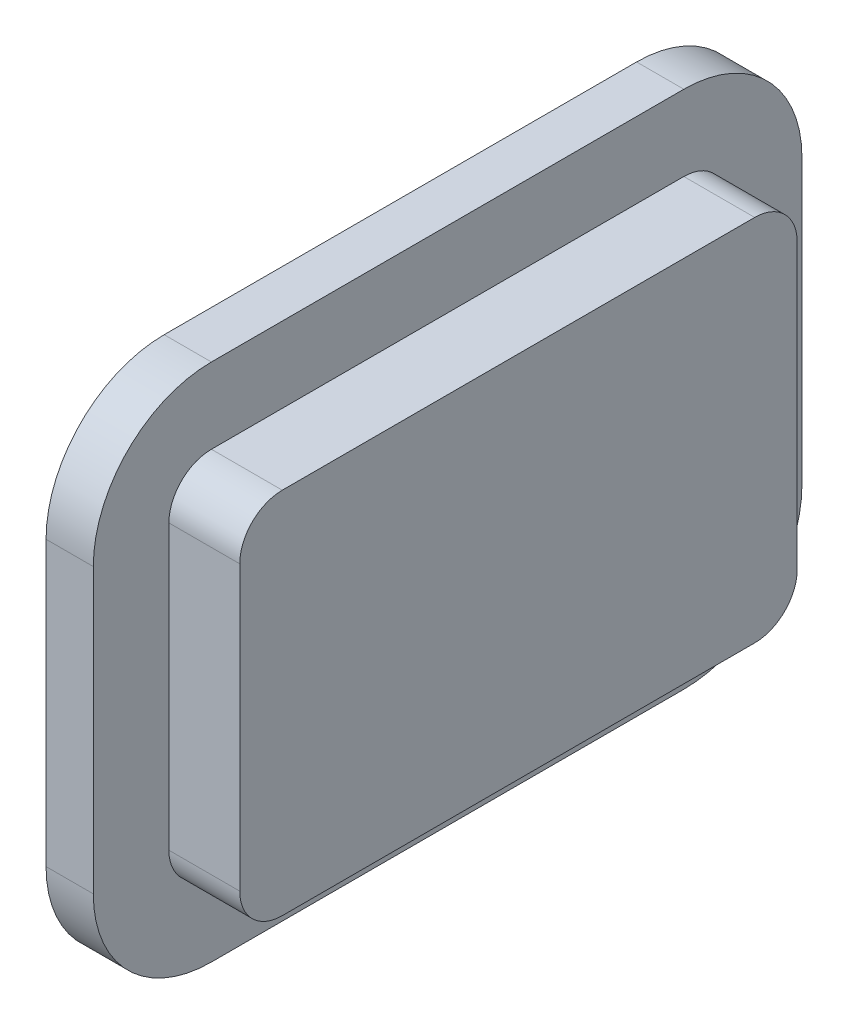
ISO-10303-21;
HEADER;
FILE_DESCRIPTION(('STEP AP214'),'2;1');
FILE_NAME('part.step','',(''),(''),'','','');
FILE_SCHEMA(('AUTOMOTIVE_DESIGN { 1 0 10303 214 1 1 1 1 }'));
ENDSEC;
DATA;
#1=APPLICATION_CONTEXT('core data for automotive mechanical design processes');
#2=APPLICATION_PROTOCOL_DEFINITION('international standard','automotive_design',2000,#1);
#3=PRODUCT_CONTEXT('',#1,'mechanical');
#4=PRODUCT('Part','Part','',(#3));
#5=PRODUCT_RELATED_PRODUCT_CATEGORY('part','',(#4));
#6=PRODUCT_DEFINITION_FORMATION('','',#4);
#7=PRODUCT_DEFINITION_CONTEXT('part definition',#1,'design');
#8=PRODUCT_DEFINITION('design','',#6,#7);
#9=PRODUCT_DEFINITION_SHAPE('','',#8);
#10=(LENGTH_UNIT() NAMED_UNIT(*) SI_UNIT(.MILLI.,.METRE.));
#11=(NAMED_UNIT(*) PLANE_ANGLE_UNIT() SI_UNIT($,.RADIAN.));
#12=(NAMED_UNIT(*) SI_UNIT($,.STERADIAN.) SOLID_ANGLE_UNIT());
#13=UNCERTAINTY_MEASURE_WITH_UNIT(LENGTH_MEASURE(1.E-05),#10,'distance_accuracy_value','');
#14=(GEOMETRIC_REPRESENTATION_CONTEXT(3) GLOBAL_UNCERTAINTY_ASSIGNED_CONTEXT((#13)) GLOBAL_UNIT_ASSIGNED_CONTEXT((#10,
#11,#12)) REPRESENTATION_CONTEXT('',''));
#15=CARTESIAN_POINT('',(0.,0.,0.));
#16=DIRECTION('',(0.,0.,1.));
#17=DIRECTION('',(1.,0.,0.));
#18=AXIS2_PLACEMENT_3D('',#15,#16,#17);
#19=CARTESIAN_POINT('',(-61.,18.8499999999999,-26.3223304703364));
#20=DIRECTION('',(0.,-1.,0.));
#21=DIRECTION('',(0.,0.,-1.));
#22=AXIS2_PLACEMENT_3D('',#19,#20,#21);
#23=PLANE('',#22);
#24=DIRECTION('',(0.,0.,-1.));
#25=VECTOR('',#24,1.);
#26=CARTESIAN_POINT('',(-60.,18.8499999999999,-26.3223304703364));
#27=LINE('',#26,#25);
#28=CARTESIAN_POINT('',(-60.,18.8499999999999,-26.3223304703364));
#29=VERTEX_POINT('',#28);
#30=CARTESIAN_POINT('',(-60.,18.8499999999999,-36.3223304703364));
#31=VERTEX_POINT('',#30);
#32=EDGE_CURVE('E164',#29,#31,#27,.T.);
#33=ORIENTED_EDGE('',*,*,#32,.T.);
#34=DIRECTION('',(1.,0.,0.));
#35=VECTOR('',#34,1.);
#36=CARTESIAN_POINT('',(-61.,18.8499999999999,-36.3223304703364));
#37=LINE('',#36,#35);
#38=CARTESIAN_POINT('',(-61.,18.8499999999999,-36.3223304703364));
#39=VERTEX_POINT('',#38);
#40=EDGE_CURVE('E11',#39,#31,#37,.T.);
#41=ORIENTED_EDGE('',*,*,#40,.F.);
#42=DIRECTION('',(0.,0.,-1.));
#43=VECTOR('',#42,1.);
#44=CARTESIAN_POINT('',(-61.,18.8499999999999,-26.3223304703364));
#45=LINE('',#44,#43);
#46=CARTESIAN_POINT('',(-61.,18.8499999999999,-26.3223304703364));
#47=VERTEX_POINT('',#46);
#48=EDGE_CURVE('E186',#47,#39,#45,.T.);
#49=ORIENTED_EDGE('',*,*,#48,.F.);
#50=DIRECTION('',(1.,0.,0.));
#51=VECTOR('',#50,1.);
#52=CARTESIAN_POINT('',(-61.,18.8499999999999,-26.3223304703364));
#53=LINE('',#52,#51);
#54=EDGE_CURVE('E160',#47,#29,#53,.T.);
#55=ORIENTED_EDGE('',*,*,#54,.T.);
#56=EDGE_LOOP('',(#33,#41,#49,#55));
#57=FACE_BOUND('',#56,.T.);
#58=ADVANCED_FACE('F43',(#57),#23,.F.);
#59=CARTESIAN_POINT('',(-61.,16.3499999999999,-36.3223304703364));
#60=DIRECTION('',(1.,0.,0.));
#61=DIRECTION('',(0.,0.,-1.));
#62=AXIS2_PLACEMENT_3D('',#59,#60,#61);
#63=CYLINDRICAL_SURFACE('',#62,2.5);
#64=CARTESIAN_POINT('',(-60.,16.3499999999999,-36.3223304703364));
#65=DIRECTION('',(-1.,0.,0.));
#66=DIRECTION('',(0.,0.,1.));
#67=AXIS2_PLACEMENT_3D('',#64,#65,#66);
#68=CIRCLE('',#67,2.5);
#69=CARTESIAN_POINT('',(-60.,16.3499999999999,-38.8223304703364));
#70=VERTEX_POINT('',#69);
#71=EDGE_CURVE('E168',#31,#70,#68,.T.);
#72=ORIENTED_EDGE('',*,*,#71,.T.);
#73=DIRECTION('',(1.,0.,0.));
#74=VECTOR('',#73,1.);
#75=CARTESIAN_POINT('',(-61.,16.3499999999999,-38.8223304703364));
#76=LINE('',#75,#74);
#77=CARTESIAN_POINT('',(-61.,16.3499999999999,-38.8223304703364));
#78=VERTEX_POINT('',#77);
#79=EDGE_CURVE('E51',#78,#70,#76,.T.);
#80=ORIENTED_EDGE('',*,*,#79,.F.);
#81=CARTESIAN_POINT('',(-61.,16.3499999999999,-36.3223304703364));
#82=DIRECTION('',(-1.,0.,0.));
#83=DIRECTION('',(0.,0.,1.));
#84=AXIS2_PLACEMENT_3D('',#81,#82,#83);
#85=CIRCLE('',#84,2.5);
#86=EDGE_CURVE('E116',#39,#78,#85,.T.);
#87=ORIENTED_EDGE('',*,*,#86,.F.);
#88=ORIENTED_EDGE('',*,*,#40,.T.);
#89=EDGE_LOOP('',(#72,#80,#87,#88));
#90=FACE_BOUND('',#89,.T.);
#91=ADVANCED_FACE('F403',(#90),#63,.T.);
#92=CARTESIAN_POINT('',(-61.,16.3499999999999,-38.8223304703364));
#93=DIRECTION('',(0.,0.,1.));
#94=DIRECTION('',(1.,0.,0.));
#95=AXIS2_PLACEMENT_3D('',#92,#93,#94);
#96=PLANE('',#95);
#97=DIRECTION('',(0.,-1.,0.));
#98=VECTOR('',#97,1.);
#99=CARTESIAN_POINT('',(-60.,16.3499999999999,-38.8223304703364));
#100=LINE('',#99,#98);
#101=CARTESIAN_POINT('',(-60.,10.3499999999999,-38.8223304703364));
#102=VERTEX_POINT('',#101);
#103=EDGE_CURVE('E172',#70,#102,#100,.T.);
#104=ORIENTED_EDGE('',*,*,#103,.T.);
#105=DIRECTION('',(1.,0.,0.));
#106=VECTOR('',#105,1.);
#107=CARTESIAN_POINT('',(-61.,10.3499999999999,-38.8223304703364));
#108=LINE('',#107,#106);
#109=CARTESIAN_POINT('',(-61.,10.3499999999999,-38.8223304703364));
#110=VERTEX_POINT('',#109);
#111=EDGE_CURVE('E195',#110,#102,#108,.T.);
#112=ORIENTED_EDGE('',*,*,#111,.F.);
#113=DIRECTION('',(0.,-1.,0.));
#114=VECTOR('',#113,1.);
#115=CARTESIAN_POINT('',(-61.,16.3499999999999,-38.8223304703364));
#116=LINE('',#115,#114);
#117=EDGE_CURVE('E206',#78,#110,#116,.T.);
#118=ORIENTED_EDGE('',*,*,#117,.F.);
#119=ORIENTED_EDGE('',*,*,#79,.T.);
#120=EDGE_LOOP('',(#104,#112,#118,#119));
#121=FACE_BOUND('',#120,.T.);
#122=ADVANCED_FACE('F204',(#121),#96,.F.);
#123=CARTESIAN_POINT('',(-61.,10.3499999999999,-36.3223304703364));
#124=DIRECTION('',(1.,0.,0.));
#125=DIRECTION('',(0.,0.,-1.));
#126=AXIS2_PLACEMENT_3D('',#123,#124,#125);
#127=CYLINDRICAL_SURFACE('',#126,2.5);
#128=CARTESIAN_POINT('',(-60.,10.3499999999999,-36.3223304703364));
#129=DIRECTION('',(-1.,0.,0.));
#130=DIRECTION('',(0.,0.,1.));
#131=AXIS2_PLACEMENT_3D('',#128,#129,#130);
#132=CIRCLE('',#131,2.5);
#133=CARTESIAN_POINT('',(-60.,7.84999999999987,-36.3223304703364));
#134=VERTEX_POINT('',#133);
#135=EDGE_CURVE('E175',#102,#134,#132,.T.);
#136=ORIENTED_EDGE('',*,*,#135,.T.);
#137=DIRECTION('',(1.,0.,0.));
#138=VECTOR('',#137,1.);
#139=CARTESIAN_POINT('',(-61.,7.84999999999987,-36.3223304703364));
#140=LINE('',#139,#138);
#141=CARTESIAN_POINT('',(-61.,7.84999999999987,-36.3223304703364));
#142=VERTEX_POINT('',#141);
#143=EDGE_CURVE('E191',#142,#134,#140,.T.);
#144=ORIENTED_EDGE('',*,*,#143,.F.);
#145=CARTESIAN_POINT('',(-61.,10.3499999999999,-36.3223304703364));
#146=DIRECTION('',(-1.,0.,0.));
#147=DIRECTION('',(0.,0.,1.));
#148=AXIS2_PLACEMENT_3D('',#145,#146,#147);
#149=CIRCLE('',#148,2.5);
#150=EDGE_CURVE('E219',#110,#142,#149,.T.);
#151=ORIENTED_EDGE('',*,*,#150,.F.);
#152=ORIENTED_EDGE('',*,*,#111,.T.);
#153=EDGE_LOOP('',(#136,#144,#151,#152));
#154=FACE_BOUND('',#153,.T.);
#155=ADVANCED_FACE('F214',(#154),#127,.T.);
#156=CARTESIAN_POINT('',(-61.,7.84999999999987,-36.3223304703364));
#157=DIRECTION('',(0.,1.,0.));
#158=DIRECTION('',(0.,0.,1.));
#159=AXIS2_PLACEMENT_3D('',#156,#157,#158);
#160=PLANE('',#159);
#161=DIRECTION('',(0.,0.,1.));
#162=VECTOR('',#161,1.);
#163=CARTESIAN_POINT('',(-60.,7.84999999999987,-36.3223304703364));
#164=LINE('',#163,#162);
#165=CARTESIAN_POINT('',(-60.,7.84999999999987,-26.3223304703364));
#166=VERTEX_POINT('',#165);
#167=EDGE_CURVE('E178',#134,#166,#164,.T.);
#168=ORIENTED_EDGE('',*,*,#167,.T.);
#169=DIRECTION('',(1.,0.,0.));
#170=VECTOR('',#169,1.);
#171=CARTESIAN_POINT('',(-61.,7.84999999999987,-26.3223304703364));
#172=LINE('',#171,#170);
#173=CARTESIAN_POINT('',(-61.,7.84999999999987,-26.3223304703364));
#174=VERTEX_POINT('',#173);
#175=EDGE_CURVE('E155',#174,#166,#172,.T.);
#176=ORIENTED_EDGE('',*,*,#175,.F.);
#177=DIRECTION('',(0.,0.,1.));
#178=VECTOR('',#177,1.);
#179=CARTESIAN_POINT('',(-61.,7.84999999999987,-36.3223304703364));
#180=LINE('',#179,#178);
#181=EDGE_CURVE('E142',#142,#174,#180,.T.);
#182=ORIENTED_EDGE('',*,*,#181,.F.);
#183=ORIENTED_EDGE('',*,*,#143,.T.);
#184=EDGE_LOOP('',(#168,#176,#182,#183));
#185=FACE_BOUND('',#184,.T.);
#186=ADVANCED_FACE('F217',(#185),#160,.F.);
#187=CARTESIAN_POINT('',(-61.,10.3499999999999,-26.3223304703364));
#188=DIRECTION('',(1.,0.,0.));
#189=DIRECTION('',(0.,0.,-1.));
#190=AXIS2_PLACEMENT_3D('',#187,#188,#189);
#191=CYLINDRICAL_SURFACE('',#190,2.5);
#192=CARTESIAN_POINT('',(-60.,10.3499999999999,-26.3223304703364));
#193=DIRECTION('',(-1.,0.,0.));
#194=DIRECTION('',(0.,0.,1.));
#195=AXIS2_PLACEMENT_3D('',#192,#193,#194);
#196=CIRCLE('',#195,2.5);
#197=CARTESIAN_POINT('',(-60.,10.3499999999999,-23.8223304703364));
#198=VERTEX_POINT('',#197);
#199=EDGE_CURVE('E152',#166,#198,#196,.T.);
#200=ORIENTED_EDGE('',*,*,#199,.T.);
#201=DIRECTION('',(1.,0.,0.));
#202=VECTOR('',#201,1.);
#203=CARTESIAN_POINT('',(-61.,10.3499999999999,-23.8223304703364));
#204=LINE('',#203,#202);
#205=CARTESIAN_POINT('',(-61.,10.3499999999999,-23.8223304703364));
#206=VERTEX_POINT('',#205);
#207=EDGE_CURVE('E149',#206,#198,#204,.T.);
#208=ORIENTED_EDGE('',*,*,#207,.F.);
#209=CARTESIAN_POINT('',(-61.,10.3499999999999,-26.3223304703364));
#210=DIRECTION('',(-1.,0.,0.));
#211=DIRECTION('',(0.,0.,1.));
#212=AXIS2_PLACEMENT_3D('',#209,#210,#211);
#213=CIRCLE('',#212,2.5);
#214=EDGE_CURVE('E135',#174,#206,#213,.T.);
#215=ORIENTED_EDGE('',*,*,#214,.F.);
#216=ORIENTED_EDGE('',*,*,#175,.T.);
#217=EDGE_LOOP('',(#200,#208,#215,#216));
#218=FACE_BOUND('',#217,.T.);
#219=ADVANCED_FACE('F150',(#218),#191,.T.);
#220=CARTESIAN_POINT('',(-61.,10.3499999999999,-23.8223304703364));
#221=DIRECTION('',(0.,0.,-1.));
#222=DIRECTION('',(-1.,0.,0.));
#223=AXIS2_PLACEMENT_3D('',#220,#221,#222);
#224=PLANE('',#223);
#225=DIRECTION('',(0.,1.,0.));
#226=VECTOR('',#225,1.);
#227=CARTESIAN_POINT('',(-60.,10.3499999999999,-23.8223304703364));
#228=LINE('',#227,#226);
#229=CARTESIAN_POINT('',(-60.,16.3499999999999,-23.8223304703364));
#230=VERTEX_POINT('',#229);
#231=EDGE_CURVE('E183',#198,#230,#228,.T.);
#232=ORIENTED_EDGE('',*,*,#231,.T.);
#233=DIRECTION('',(1.,0.,0.));
#234=VECTOR('',#233,1.);
#235=CARTESIAN_POINT('',(-61.,16.3499999999999,-23.8223304703364));
#236=LINE('',#235,#234);
#237=CARTESIAN_POINT('',(-61.,16.3499999999999,-23.8223304703364));
#238=VERTEX_POINT('',#237);
#239=EDGE_CURVE('E156',#238,#230,#236,.T.);
#240=ORIENTED_EDGE('',*,*,#239,.F.);
#241=DIRECTION('',(0.,1.,0.));
#242=VECTOR('',#241,1.);
#243=CARTESIAN_POINT('',(-61.,10.3499999999999,-23.8223304703364));
#244=LINE('',#243,#242);
#245=EDGE_CURVE('E139',#206,#238,#244,.T.);
#246=ORIENTED_EDGE('',*,*,#245,.F.);
#247=ORIENTED_EDGE('',*,*,#207,.T.);
#248=EDGE_LOOP('',(#232,#240,#246,#247));
#249=FACE_BOUND('',#248,.T.);
#250=ADVANCED_FACE('F158',(#249),#224,.F.);
#251=CARTESIAN_POINT('',(-61.,16.3499999999999,-26.3223304703364));
#252=DIRECTION('',(1.,0.,0.));
#253=DIRECTION('',(0.,0.,-1.));
#254=AXIS2_PLACEMENT_3D('',#251,#252,#253);
#255=CYLINDRICAL_SURFACE('',#254,2.5);
#256=CARTESIAN_POINT('',(-60.,16.3499999999999,-26.3223304703364));
#257=DIRECTION('',(-1.,0.,0.));
#258=DIRECTION('',(0.,0.,1.));
#259=AXIS2_PLACEMENT_3D('',#256,#257,#258);
#260=CIRCLE('',#259,2.5);
#261=EDGE_CURVE('E105',#230,#29,#260,.T.);
#262=ORIENTED_EDGE('',*,*,#261,.T.);
#263=ORIENTED_EDGE('',*,*,#54,.F.);
#264=CARTESIAN_POINT('',(-61.,16.3499999999999,-26.3223304703364));
#265=DIRECTION('',(-1.,0.,0.));
#266=DIRECTION('',(0.,0.,1.));
#267=AXIS2_PLACEMENT_3D('',#264,#265,#266);
#268=CIRCLE('',#267,2.5);
#269=EDGE_CURVE('E67',#238,#47,#268,.T.);
#270=ORIENTED_EDGE('',*,*,#269,.F.);
#271=ORIENTED_EDGE('',*,*,#239,.T.);
#272=EDGE_LOOP('',(#262,#263,#270,#271));
#273=FACE_BOUND('',#272,.T.);
#274=ADVANCED_FACE('F410',(#273),#255,.T.);
#275=CARTESIAN_POINT('',(-61.,16.3499999999999,-36.3223304703364));
#276=DIRECTION('',(-1.,0.,0.));
#277=DIRECTION('',(0.,0.,1.));
#278=AXIS2_PLACEMENT_3D('',#275,#276,#277);
#279=PLANE('',#278);
#280=ORIENTED_EDGE('',*,*,#48,.T.);
#281=ORIENTED_EDGE('',*,*,#86,.T.);
#282=ORIENTED_EDGE('',*,*,#117,.T.);
#283=ORIENTED_EDGE('',*,*,#150,.T.);
#284=ORIENTED_EDGE('',*,*,#181,.T.);
#285=ORIENTED_EDGE('',*,*,#214,.T.);
#286=ORIENTED_EDGE('',*,*,#245,.T.);
#287=ORIENTED_EDGE('',*,*,#269,.T.);
#288=EDGE_LOOP('',(#280,#281,#282,#283,#284,#285,#286,#287));
#289=FACE_BOUND('',#288,.T.);
#290=ADVANCED_FACE('F137',(#289),#279,.T.);
#291=CARTESIAN_POINT('',(-60.,16.3499999999999,-36.3223304703364));
#292=DIRECTION('',(-1.,0.,0.));
#293=DIRECTION('',(0.,0.,1.));
#294=AXIS2_PLACEMENT_3D('',#291,#292,#293);
#295=PLANE('',#294);
#296=DIRECTION('',(0.,1.,0.));
#297=VECTOR('',#296,1.);
#298=CARTESIAN_POINT('',(-60.,10.3499999999999,-25.4223304703364));
#299=LINE('',#298,#297);
#300=CARTESIAN_POINT('',(-60.,10.3499999999999,-25.4223304703364));
#301=VERTEX_POINT('',#300);
#302=CARTESIAN_POINT('',(-60.,16.3499999999999,-25.4223304703364));
#303=VERTEX_POINT('',#302);
#304=EDGE_CURVE('E258',#301,#303,#299,.T.);
#305=ORIENTED_EDGE('',*,*,#304,.T.);
#306=CARTESIAN_POINT('',(-60.,16.3499999999999,-26.3223304703364));
#307=DIRECTION('',(-1.,0.,0.));
#308=DIRECTION('',(0.,0.,1.));
#309=AXIS2_PLACEMENT_3D('',#306,#307,#308);
#310=CIRCLE('',#309,0.9);
#311=CARTESIAN_POINT('',(-60.,17.2499999999999,-26.3223304703364));
#312=VERTEX_POINT('',#311);
#313=EDGE_CURVE('E58',#303,#312,#310,.T.);
#314=ORIENTED_EDGE('',*,*,#313,.T.);
#315=DIRECTION('',(0.,0.,-1.));
#316=VECTOR('',#315,1.);
#317=CARTESIAN_POINT('',(-60.,17.2499999999999,-26.3223304703364));
#318=LINE('',#317,#316);
#319=CARTESIAN_POINT('',(-60.,17.2499999999999,-36.3223304703364));
#320=VERTEX_POINT('',#319);
#321=EDGE_CURVE('E283',#312,#320,#318,.T.);
#322=ORIENTED_EDGE('',*,*,#321,.T.);
#323=CARTESIAN_POINT('',(-60.,16.3499999999999,-36.3223304703364));
#324=DIRECTION('',(-1.,0.,0.));
#325=DIRECTION('',(0.,0.,1.));
#326=AXIS2_PLACEMENT_3D('',#323,#324,#325);
#327=CIRCLE('',#326,0.899999999999998);
#328=CARTESIAN_POINT('',(-60.,16.3499999999999,-37.2223304703364));
#329=VERTEX_POINT('',#328);
#330=EDGE_CURVE('E279',#320,#329,#327,.T.);
#331=ORIENTED_EDGE('',*,*,#330,.T.);
#332=DIRECTION('',(0.,-1.,0.));
#333=VECTOR('',#332,1.);
#334=CARTESIAN_POINT('',(-60.,16.3499999999999,-37.2223304703364));
#335=LINE('',#334,#333);
#336=CARTESIAN_POINT('',(-60.,10.3499999999999,-37.2223304703364));
#337=VERTEX_POINT('',#336);
#338=EDGE_CURVE('E275',#329,#337,#335,.T.);
#339=ORIENTED_EDGE('',*,*,#338,.T.);
#340=CARTESIAN_POINT('',(-60.,10.3499999999999,-36.3223304703364));
#341=DIRECTION('',(-1.,0.,0.));
#342=DIRECTION('',(0.,0.,1.));
#343=AXIS2_PLACEMENT_3D('',#340,#341,#342);
#344=CIRCLE('',#343,0.9);
#345=CARTESIAN_POINT('',(-60.,9.44999999999987,-36.3223304703364));
#346=VERTEX_POINT('',#345);
#347=EDGE_CURVE('E271',#337,#346,#344,.T.);
#348=ORIENTED_EDGE('',*,*,#347,.T.);
#349=DIRECTION('',(0.,0.,1.));
#350=VECTOR('',#349,1.);
#351=CARTESIAN_POINT('',(-60.,9.44999999999987,-36.3223304703364));
#352=LINE('',#351,#350);
#353=CARTESIAN_POINT('',(-60.,9.44999999999987,-26.3223304703364));
#354=VERTEX_POINT('',#353);
#355=EDGE_CURVE('E267',#346,#354,#352,.T.);
#356=ORIENTED_EDGE('',*,*,#355,.T.);
#357=CARTESIAN_POINT('',(-60.,10.3499999999999,-26.3223304703364));
#358=DIRECTION('',(-1.,0.,0.));
#359=DIRECTION('',(0.,0.,1.));
#360=AXIS2_PLACEMENT_3D('',#357,#358,#359);
#361=CIRCLE('',#360,0.900000000000001);
#362=EDGE_CURVE('E263',#354,#301,#361,.T.);
#363=ORIENTED_EDGE('',*,*,#362,.T.);
#364=EDGE_LOOP('',(#305,#314,#322,#331,#339,#348,#356,#363));
#365=FACE_BOUND('',#364,.T.);
#366=ORIENTED_EDGE('',*,*,#32,.F.);
#367=ORIENTED_EDGE('',*,*,#261,.F.);
#368=ORIENTED_EDGE('',*,*,#231,.F.);
#369=ORIENTED_EDGE('',*,*,#199,.F.);
#370=ORIENTED_EDGE('',*,*,#167,.F.);
#371=ORIENTED_EDGE('',*,*,#135,.F.);
#372=ORIENTED_EDGE('',*,*,#103,.F.);
#373=ORIENTED_EDGE('',*,*,#71,.F.);
#374=EDGE_LOOP('',(#366,#367,#368,#369,#370,#371,#372,#373));
#375=FACE_BOUND('',#374,.T.);
#376=ADVANCED_FACE('F210',(#365,#375),#295,.F.);
#377=CARTESIAN_POINT('',(-58.5,16.3499999999999,-26.3223304703364));
#378=DIRECTION('',(-1.,0.,0.));
#379=DIRECTION('',(0.,0.,1.));
#380=AXIS2_PLACEMENT_3D('',#377,#378,#379);
#381=CYLINDRICAL_SURFACE('',#380,0.9);
#382=ORIENTED_EDGE('',*,*,#313,.F.);
#383=DIRECTION('',(-1.,0.,0.));
#384=VECTOR('',#383,1.);
#385=CARTESIAN_POINT('',(-58.5,16.3499999999999,-25.4223304703364));
#386=LINE('',#385,#384);
#387=CARTESIAN_POINT('',(-58.5,16.3499999999999,-25.4223304703364));
#388=VERTEX_POINT('',#387);
#389=EDGE_CURVE('E169',#388,#303,#386,.T.);
#390=ORIENTED_EDGE('',*,*,#389,.F.);
#391=CARTESIAN_POINT('',(-58.5,16.3499999999999,-26.3223304703364));
#392=DIRECTION('',(-1.,0.,0.));
#393=DIRECTION('',(0.,0.,1.));
#394=AXIS2_PLACEMENT_3D('',#391,#392,#393);
#395=CIRCLE('',#394,0.9);
#396=CARTESIAN_POINT('',(-58.5,17.2499999999999,-26.3223304703364));
#397=VERTEX_POINT('',#396);
#398=EDGE_CURVE('E262',#388,#397,#395,.T.);
#399=ORIENTED_EDGE('',*,*,#398,.T.);
#400=DIRECTION('',(-1.,0.,0.));
#401=VECTOR('',#400,1.);
#402=CARTESIAN_POINT('',(-58.5,17.2499999999999,-26.3223304703364));
#403=LINE('',#402,#401);
#404=EDGE_CURVE('E229',#397,#312,#403,.T.);
#405=ORIENTED_EDGE('',*,*,#404,.T.);
#406=EDGE_LOOP('',(#382,#390,#399,#405));
#407=FACE_BOUND('',#406,.T.);
#408=ADVANCED_FACE('F318',(#407),#381,.T.);
#409=CARTESIAN_POINT('',(-58.5,10.3499999999999,-25.4223304703364));
#410=DIRECTION('',(0.,0.,1.));
#411=DIRECTION('',(1.,0.,0.));
#412=AXIS2_PLACEMENT_3D('',#409,#410,#411);
#413=PLANE('',#412);
#414=ORIENTED_EDGE('',*,*,#304,.F.);
#415=DIRECTION('',(-1.,0.,0.));
#416=VECTOR('',#415,1.);
#417=CARTESIAN_POINT('',(-58.5,10.3499999999999,-25.4223304703364));
#418=LINE('',#417,#416);
#419=CARTESIAN_POINT('',(-58.5,10.3499999999999,-25.4223304703364));
#420=VERTEX_POINT('',#419);
#421=EDGE_CURVE('E253',#420,#301,#418,.T.);
#422=ORIENTED_EDGE('',*,*,#421,.F.);
#423=DIRECTION('',(0.,1.,0.));
#424=VECTOR('',#423,1.);
#425=CARTESIAN_POINT('',(-58.5,10.3499999999999,-25.4223304703364));
#426=LINE('',#425,#424);
#427=EDGE_CURVE('E233',#420,#388,#426,.T.);
#428=ORIENTED_EDGE('',*,*,#427,.T.);
#429=ORIENTED_EDGE('',*,*,#389,.T.);
#430=EDGE_LOOP('',(#414,#422,#428,#429));
#431=FACE_BOUND('',#430,.T.);
#432=ADVANCED_FACE('F336',(#431),#413,.T.);
#433=CARTESIAN_POINT('',(-58.5,10.3499999999999,-26.3223304703364));
#434=DIRECTION('',(-1.,0.,0.));
#435=DIRECTION('',(0.,0.,1.));
#436=AXIS2_PLACEMENT_3D('',#433,#434,#435);
#437=CYLINDRICAL_SURFACE('',#436,0.900000000000001);
#438=ORIENTED_EDGE('',*,*,#362,.F.);
#439=DIRECTION('',(-1.,0.,0.));
#440=VECTOR('',#439,1.);
#441=CARTESIAN_POINT('',(-58.5,9.44999999999987,-26.3223304703364));
#442=LINE('',#441,#440);
#443=CARTESIAN_POINT('',(-58.5,9.44999999999987,-26.3223304703364));
#444=VERTEX_POINT('',#443);
#445=EDGE_CURVE('E249',#444,#354,#442,.T.);
#446=ORIENTED_EDGE('',*,*,#445,.F.);
#447=CARTESIAN_POINT('',(-58.5,10.3499999999999,-26.3223304703364));
#448=DIRECTION('',(-1.,0.,0.));
#449=DIRECTION('',(0.,0.,1.));
#450=AXIS2_PLACEMENT_3D('',#447,#448,#449);
#451=CIRCLE('',#450,0.900000000000001);
#452=EDGE_CURVE('E290',#444,#420,#451,.T.);
#453=ORIENTED_EDGE('',*,*,#452,.T.);
#454=ORIENTED_EDGE('',*,*,#421,.T.);
#455=EDGE_LOOP('',(#438,#446,#453,#454));
#456=FACE_BOUND('',#455,.T.);
#457=ADVANCED_FACE('F343',(#456),#437,.T.);
#458=CARTESIAN_POINT('',(-58.5,9.44999999999987,-36.3223304703364));
#459=DIRECTION('',(0.,-1.,0.));
#460=DIRECTION('',(0.,0.,-1.));
#461=AXIS2_PLACEMENT_3D('',#458,#459,#460);
#462=PLANE('',#461);
#463=ORIENTED_EDGE('',*,*,#355,.F.);
#464=DIRECTION('',(-1.,0.,0.));
#465=VECTOR('',#464,1.);
#466=CARTESIAN_POINT('',(-58.5,9.44999999999987,-36.3223304703364));
#467=LINE('',#466,#465);
#468=CARTESIAN_POINT('',(-58.5,9.44999999999987,-36.3223304703364));
#469=VERTEX_POINT('',#468);
#470=EDGE_CURVE('E245',#469,#346,#467,.T.);
#471=ORIENTED_EDGE('',*,*,#470,.F.);
#472=DIRECTION('',(0.,0.,1.));
#473=VECTOR('',#472,1.);
#474=CARTESIAN_POINT('',(-58.5,9.44999999999987,-36.3223304703364));
#475=LINE('',#474,#473);
#476=EDGE_CURVE('E294',#469,#444,#475,.T.);
#477=ORIENTED_EDGE('',*,*,#476,.T.);
#478=ORIENTED_EDGE('',*,*,#445,.T.);
#479=EDGE_LOOP('',(#463,#471,#477,#478));
#480=FACE_BOUND('',#479,.T.);
#481=ADVANCED_FACE('F351',(#480),#462,.T.);
#482=CARTESIAN_POINT('',(-58.5,10.3499999999999,-36.3223304703364));
#483=DIRECTION('',(-1.,0.,0.));
#484=DIRECTION('',(0.,0.,1.));
#485=AXIS2_PLACEMENT_3D('',#482,#483,#484);
#486=CYLINDRICAL_SURFACE('',#485,0.9);
#487=ORIENTED_EDGE('',*,*,#347,.F.);
#488=DIRECTION('',(-1.,0.,0.));
#489=VECTOR('',#488,1.);
#490=CARTESIAN_POINT('',(-58.5,10.3499999999999,-37.2223304703364));
#491=LINE('',#490,#489);
#492=CARTESIAN_POINT('',(-58.5,10.3499999999999,-37.2223304703364));
#493=VERTEX_POINT('',#492);
#494=EDGE_CURVE('E241',#493,#337,#491,.T.);
#495=ORIENTED_EDGE('',*,*,#494,.F.);
#496=CARTESIAN_POINT('',(-58.5,10.3499999999999,-36.3223304703364));
#497=DIRECTION('',(-1.,0.,0.));
#498=DIRECTION('',(0.,0.,1.));
#499=AXIS2_PLACEMENT_3D('',#496,#497,#498);
#500=CIRCLE('',#499,0.9);
#501=EDGE_CURVE('E298',#493,#469,#500,.T.);
#502=ORIENTED_EDGE('',*,*,#501,.T.);
#503=ORIENTED_EDGE('',*,*,#470,.T.);
#504=EDGE_LOOP('',(#487,#495,#502,#503));
#505=FACE_BOUND('',#504,.T.);
#506=ADVANCED_FACE('F359',(#505),#486,.T.);
#507=CARTESIAN_POINT('',(-58.5,16.3499999999999,-37.2223304703364));
#508=DIRECTION('',(0.,0.,-1.));
#509=DIRECTION('',(-1.,0.,0.));
#510=AXIS2_PLACEMENT_3D('',#507,#508,#509);
#511=PLANE('',#510);
#512=ORIENTED_EDGE('',*,*,#338,.F.);
#513=DIRECTION('',(-1.,0.,0.));
#514=VECTOR('',#513,1.);
#515=CARTESIAN_POINT('',(-58.5,16.3499999999999,-37.2223304703364));
#516=LINE('',#515,#514);
#517=CARTESIAN_POINT('',(-58.5,16.3499999999999,-37.2223304703364));
#518=VERTEX_POINT('',#517);
#519=EDGE_CURVE('E237',#518,#329,#516,.T.);
#520=ORIENTED_EDGE('',*,*,#519,.F.);
#521=DIRECTION('',(0.,-1.,0.));
#522=VECTOR('',#521,1.);
#523=CARTESIAN_POINT('',(-58.5,16.3499999999999,-37.2223304703364));
#524=LINE('',#523,#522);
#525=EDGE_CURVE('E302',#518,#493,#524,.T.);
#526=ORIENTED_EDGE('',*,*,#525,.T.);
#527=ORIENTED_EDGE('',*,*,#494,.T.);
#528=EDGE_LOOP('',(#512,#520,#526,#527));
#529=FACE_BOUND('',#528,.T.);
#530=ADVANCED_FACE('F393',(#529),#511,.T.);
#531=CARTESIAN_POINT('',(-58.5,16.3499999999999,-36.3223304703364));
#532=DIRECTION('',(-1.,0.,0.));
#533=DIRECTION('',(0.,0.,1.));
#534=AXIS2_PLACEMENT_3D('',#531,#532,#533);
#535=CYLINDRICAL_SURFACE('',#534,0.899999999999998);
#536=ORIENTED_EDGE('',*,*,#330,.F.);
#537=DIRECTION('',(-1.,0.,0.));
#538=VECTOR('',#537,1.);
#539=CARTESIAN_POINT('',(-58.5,17.2499999999999,-36.3223304703364));
#540=LINE('',#539,#538);
#541=CARTESIAN_POINT('',(-58.5,17.2499999999999,-36.3223304703364));
#542=VERTEX_POINT('',#541);
#543=EDGE_CURVE('E232',#542,#320,#540,.T.);
#544=ORIENTED_EDGE('',*,*,#543,.F.);
#545=CARTESIAN_POINT('',(-58.5,16.3499999999999,-36.3223304703364));
#546=DIRECTION('',(-1.,0.,0.));
#547=DIRECTION('',(0.,0.,1.));
#548=AXIS2_PLACEMENT_3D('',#545,#546,#547);
#549=CIRCLE('',#548,0.899999999999998);
#550=EDGE_CURVE('E306',#542,#518,#549,.T.);
#551=ORIENTED_EDGE('',*,*,#550,.T.);
#552=ORIENTED_EDGE('',*,*,#519,.T.);
#553=EDGE_LOOP('',(#536,#544,#551,#552));
#554=FACE_BOUND('',#553,.T.);
#555=ADVANCED_FACE('F385',(#554),#535,.T.);
#556=CARTESIAN_POINT('',(-58.5,17.2499999999999,-26.3223304703364));
#557=DIRECTION('',(0.,1.,0.));
#558=DIRECTION('',(0.,0.,1.));
#559=AXIS2_PLACEMENT_3D('',#556,#557,#558);
#560=PLANE('',#559);
#561=ORIENTED_EDGE('',*,*,#321,.F.);
#562=ORIENTED_EDGE('',*,*,#404,.F.);
#563=DIRECTION('',(0.,0.,-1.));
#564=VECTOR('',#563,1.);
#565=CARTESIAN_POINT('',(-58.5,17.2499999999999,-26.3223304703364));
#566=LINE('',#565,#564);
#567=EDGE_CURVE('E310',#397,#542,#566,.T.);
#568=ORIENTED_EDGE('',*,*,#567,.T.);
#569=ORIENTED_EDGE('',*,*,#543,.T.);
#570=EDGE_LOOP('',(#561,#562,#568,#569));
#571=FACE_BOUND('',#570,.T.);
#572=ADVANCED_FACE('F388',(#571),#560,.T.);
#573=CARTESIAN_POINT('',(-58.5,16.3499999999999,-26.3223304703364));
#574=DIRECTION('',(-1.,0.,0.));
#575=DIRECTION('',(0.,0.,1.));
#576=AXIS2_PLACEMENT_3D('',#573,#574,#575);
#577=PLANE('',#576);
#578=ORIENTED_EDGE('',*,*,#398,.F.);
#579=ORIENTED_EDGE('',*,*,#427,.F.);
#580=ORIENTED_EDGE('',*,*,#452,.F.);
#581=ORIENTED_EDGE('',*,*,#476,.F.);
#582=ORIENTED_EDGE('',*,*,#501,.F.);
#583=ORIENTED_EDGE('',*,*,#525,.F.);
#584=ORIENTED_EDGE('',*,*,#550,.F.);
#585=ORIENTED_EDGE('',*,*,#567,.F.);
#586=EDGE_LOOP('',(#578,#579,#580,#581,#582,#583,#584,#585));
#587=FACE_BOUND('',#586,.T.);
#588=ADVANCED_FACE('F328',(#587),#577,.F.);
#589=CLOSED_SHELL('',(#58,#91,#122,#155,#186,#219,#250,#274,#290,#376,#408,#432,#457,#481,#506,
#530,#555,#572,#588));
#590=MANIFOLD_SOLID_BREP('B2',#589);
#591=ADVANCED_BREP_SHAPE_REPRESENTATION('',(#18,#590),#14);
#592=SHAPE_DEFINITION_REPRESENTATION(#9,#591);
ENDSEC;
END-ISO-10303-21;
